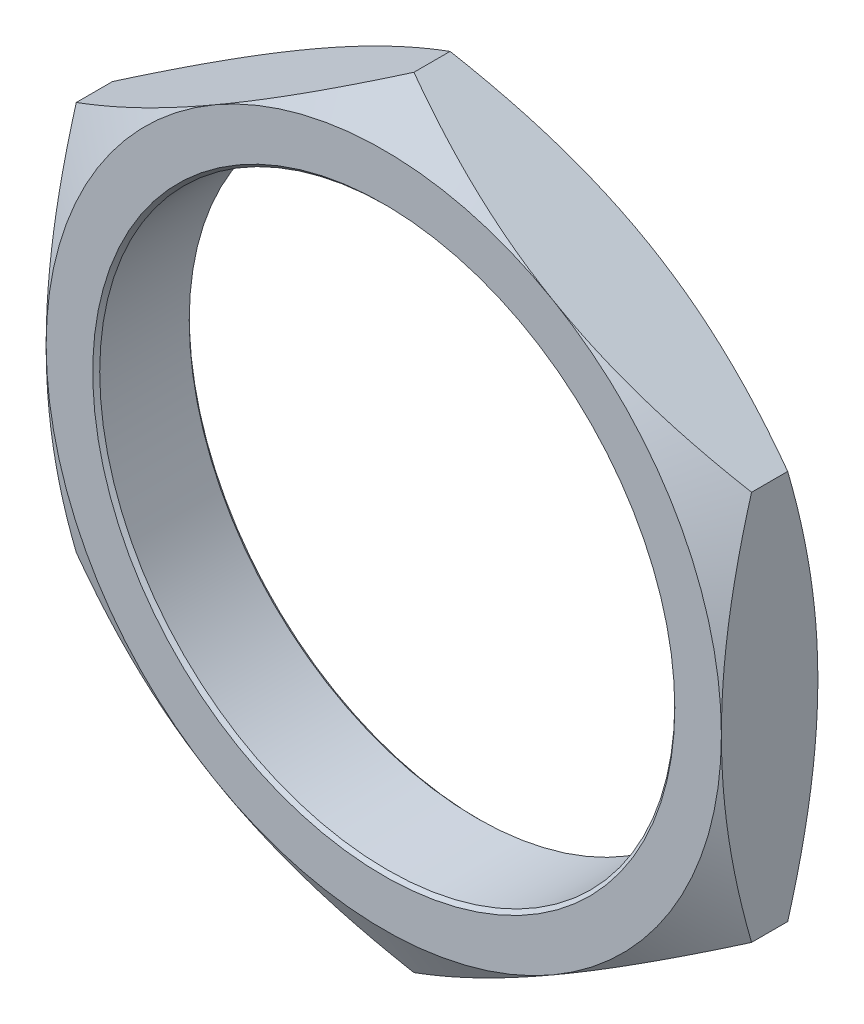
ISO-10303-21;
HEADER;
FILE_DESCRIPTION(('STEP AP214'),'2;1');
FILE_NAME('part.step','',(''),(''),'','','');
FILE_SCHEMA(('AUTOMOTIVE_DESIGN { 1 0 10303 214 1 1 1 1 }'));
ENDSEC;
DATA;
#1=APPLICATION_CONTEXT('core data for automotive mechanical design processes');
#2=APPLICATION_PROTOCOL_DEFINITION('international standard','automotive_design',2000,#1);
#3=PRODUCT_CONTEXT('',#1,'mechanical');
#4=PRODUCT('Part','Part','',(#3));
#5=PRODUCT_RELATED_PRODUCT_CATEGORY('part','',(#4));
#6=PRODUCT_DEFINITION_FORMATION('','',#4);
#7=PRODUCT_DEFINITION_CONTEXT('part definition',#1,'design');
#8=PRODUCT_DEFINITION('design','',#6,#7);
#9=PRODUCT_DEFINITION_SHAPE('','',#8);
#10=(LENGTH_UNIT() NAMED_UNIT(*) SI_UNIT(.MILLI.,.METRE.));
#11=(NAMED_UNIT(*) PLANE_ANGLE_UNIT() SI_UNIT($,.RADIAN.));
#12=(NAMED_UNIT(*) SI_UNIT($,.STERADIAN.) SOLID_ANGLE_UNIT());
#13=UNCERTAINTY_MEASURE_WITH_UNIT(LENGTH_MEASURE(1.E-05),#10,'distance_accuracy_value','');
#14=(GEOMETRIC_REPRESENTATION_CONTEXT(3) GLOBAL_UNCERTAINTY_ASSIGNED_CONTEXT((#13)) GLOBAL_UNIT_ASSIGNED_CONTEXT((#10,
#11,#12)) REPRESENTATION_CONTEXT('',''));
#15=CARTESIAN_POINT('',(0.,0.,0.));
#16=DIRECTION('',(0.,0.,1.));
#17=DIRECTION('',(1.,0.,0.));
#18=AXIS2_PLACEMENT_3D('',#15,#16,#17);
#19=CARTESIAN_POINT('',(0.,0.,3.175));
#20=DIRECTION('',(0.,0.,-1.));
#21=DIRECTION('',(0.,-1.,0.));
#22=AXIS2_PLACEMENT_3D('',#19,#20,#21);
#23=CONICAL_SURFACE('',#22,9.57860794404232,0.785398163397448);
#24=CARTESIAN_POINT('',(0.,0.,3.28956794404232));
#25=DIRECTION('',(0.,0.,1.));
#26=DIRECTION('',(1.,0.,0.));
#27=AXIS2_PLACEMENT_3D('',#24,#25,#26);
#28=CIRCLE('',#27,9.46404);
#29=CARTESIAN_POINT('',(9.46404,0.,3.28956794404232));
#30=VERTEX_POINT('',#29);
#31=EDGE_CURVE('E11',#30,#30,#28,.T.);
#32=ORIENTED_EDGE('',*,*,#31,.T.);
#33=EDGE_LOOP('',(#32));
#34=FACE_BOUND('',#33,.T.);
#35=CARTESIAN_POINT('',(0.,0.,3.175));
#36=DIRECTION('',(0.,0.,1.));
#37=DIRECTION('',(1.,0.,0.));
#38=AXIS2_PLACEMENT_3D('',#35,#36,#37);
#39=CIRCLE('',#38,9.57860794404232);
#40=CARTESIAN_POINT('',(9.57860794404232,0.,3.175));
#41=VERTEX_POINT('',#40);
#42=EDGE_CURVE('E337',#41,#41,#39,.T.);
#43=ORIENTED_EDGE('',*,*,#42,.F.);
#44=EDGE_LOOP('',(#43));
#45=FACE_BOUND('',#44,.T.);
#46=ADVANCED_FACE('F16',(#34,#45),#23,.F.);
#47=CARTESIAN_POINT('',(0.,0.,6.23543205595769));
#48=DIRECTION('',(0.,0.,1.));
#49=DIRECTION('',(1.,0.,0.));
#50=AXIS2_PLACEMENT_3D('',#47,#48,#49);
#51=CONICAL_SURFACE('',#50,9.46404,0.785398163397441);
#52=CARTESIAN_POINT('',(0.,0.,6.23543205595769));
#53=DIRECTION('',(0.,0.,1.));
#54=DIRECTION('',(1.,0.,0.));
#55=AXIS2_PLACEMENT_3D('',#52,#53,#54);
#56=CIRCLE('',#55,9.46404);
#57=CARTESIAN_POINT('',(9.46404,0.,6.23543205595769));
#58=VERTEX_POINT('',#57);
#59=EDGE_CURVE('E347',#58,#58,#56,.T.);
#60=ORIENTED_EDGE('',*,*,#59,.F.);
#61=EDGE_LOOP('',(#60));
#62=FACE_BOUND('',#61,.T.);
#63=CARTESIAN_POINT('',(0.,0.,6.35));
#64=DIRECTION('',(0.,0.,1.));
#65=DIRECTION('',(1.,0.,0.));
#66=AXIS2_PLACEMENT_3D('',#63,#64,#65);
#67=CIRCLE('',#66,9.57860794404232);
#68=CARTESIAN_POINT('',(9.57860794404232,0.,6.35));
#69=VERTEX_POINT('',#68);
#70=EDGE_CURVE('E28',#69,#69,#67,.T.);
#71=ORIENTED_EDGE('',*,*,#70,.T.);
#72=EDGE_LOOP('',(#71));
#73=FACE_BOUND('',#72,.T.);
#74=ADVANCED_FACE('F356',(#62,#73),#51,.F.);
#75=CARTESIAN_POINT('',(0.,0.,6.35));
#76=DIRECTION('',(0.,0.,-1.));
#77=DIRECTION('',(0.,-1.,0.));
#78=AXIS2_PLACEMENT_3D('',#75,#76,#77);
#79=CYLINDRICAL_SURFACE('',#78,9.46404);
#80=ORIENTED_EDGE('',*,*,#59,.T.);
#81=EDGE_LOOP('',(#80));
#82=FACE_BOUND('',#81,.T.);
#83=ORIENTED_EDGE('',*,*,#31,.F.);
#84=EDGE_LOOP('',(#83));
#85=FACE_BOUND('',#84,.T.);
#86=ADVANCED_FACE('F363',(#82,#85),#79,.F.);
#87=CARTESIAN_POINT('',(0.,12.8316097327394,3.175));
#88=DIRECTION('',(0.,0.,1.));
#89=DIRECTION('',(1.,0.,0.));
#90=AXIS2_PLACEMENT_3D('',#87,#88,#89);
#91=PLANE('',#90);
#92=CARTESIAN_POINT('',(0.,0.,3.175));
#93=DIRECTION('',(0.,0.,1.));
#94=DIRECTION('',(1.,0.,0.));
#95=AXIS2_PLACEMENT_3D('',#92,#93,#94);
#96=CIRCLE('',#95,11.1125);
#97=CARTESIAN_POINT('',(11.1125,0.,3.175));
#98=VERTEX_POINT('',#97);
#99=CARTESIAN_POINT('',(5.55625,9.62370729955457,3.175));
#100=VERTEX_POINT('',#99);
#101=EDGE_CURVE('E37',#98,#100,#96,.T.);
#102=ORIENTED_EDGE('',*,*,#101,.F.);
#103=CARTESIAN_POINT('',(0.,0.,3.175));
#104=DIRECTION('',(0.,0.,1.));
#105=DIRECTION('',(1.,0.,0.));
#106=AXIS2_PLACEMENT_3D('',#103,#104,#105);
#107=CIRCLE('',#106,11.1125);
#108=CARTESIAN_POINT('',(5.55625,-9.62370729955457,3.175));
#109=VERTEX_POINT('',#108);
#110=EDGE_CURVE('E185',#109,#98,#107,.T.);
#111=ORIENTED_EDGE('',*,*,#110,.F.);
#112=CARTESIAN_POINT('',(0.,0.,3.175));
#113=DIRECTION('',(0.,0.,1.));
#114=DIRECTION('',(1.,0.,0.));
#115=AXIS2_PLACEMENT_3D('',#112,#113,#114);
#116=CIRCLE('',#115,11.1125);
#117=CARTESIAN_POINT('',(-5.55625,-9.62370729955457,3.175));
#118=VERTEX_POINT('',#117);
#119=EDGE_CURVE('E164',#118,#109,#116,.T.);
#120=ORIENTED_EDGE('',*,*,#119,.F.);
#121=CARTESIAN_POINT('',(0.,0.,3.175));
#122=DIRECTION('',(0.,0.,1.));
#123=DIRECTION('',(1.,0.,0.));
#124=AXIS2_PLACEMENT_3D('',#121,#122,#123);
#125=CIRCLE('',#124,11.1125);
#126=CARTESIAN_POINT('',(-11.1125,0.,3.175));
#127=VERTEX_POINT('',#126);
#128=EDGE_CURVE('E194',#127,#118,#125,.T.);
#129=ORIENTED_EDGE('',*,*,#128,.F.);
#130=CARTESIAN_POINT('',(0.,0.,3.175));
#131=DIRECTION('',(0.,0.,1.));
#132=DIRECTION('',(1.,0.,0.));
#133=AXIS2_PLACEMENT_3D('',#130,#131,#132);
#134=CIRCLE('',#133,11.1125);
#135=CARTESIAN_POINT('',(-5.55625,9.62370729955457,3.175));
#136=VERTEX_POINT('',#135);
#137=EDGE_CURVE('E262',#136,#127,#134,.T.);
#138=ORIENTED_EDGE('',*,*,#137,.F.);
#139=CARTESIAN_POINT('',(0.,0.,3.175));
#140=DIRECTION('',(0.,0.,1.));
#141=DIRECTION('',(1.,0.,0.));
#142=AXIS2_PLACEMENT_3D('',#139,#140,#141);
#143=CIRCLE('',#142,11.1125);
#144=EDGE_CURVE('E293',#100,#136,#143,.T.);
#145=ORIENTED_EDGE('',*,*,#144,.F.);
#146=EDGE_LOOP('',(#102,#111,#120,#129,#138,#145));
#147=FACE_BOUND('',#146,.T.);
#148=ORIENTED_EDGE('',*,*,#42,.T.);
#149=EDGE_LOOP('',(#148));
#150=FACE_BOUND('',#149,.T.);
#151=ADVANCED_FACE('F353',(#147,#150),#91,.F.);
#152=CARTESIAN_POINT('',(0.,12.8316097327394,6.35));
#153=DIRECTION('',(0.,0.,1.));
#154=DIRECTION('',(1.,0.,0.));
#155=AXIS2_PLACEMENT_3D('',#152,#153,#154);
#156=PLANE('',#155);
#157=CARTESIAN_POINT('',(0.,0.,6.35));
#158=DIRECTION('',(0.,0.,1.));
#159=DIRECTION('',(1.,0.,0.));
#160=AXIS2_PLACEMENT_3D('',#157,#158,#159);
#161=CIRCLE('',#160,11.1125);
#162=CARTESIAN_POINT('',(5.55625,-9.62370729955457,6.35));
#163=VERTEX_POINT('',#162);
#164=CARTESIAN_POINT('',(11.1125,0.,6.35));
#165=VERTEX_POINT('',#164);
#166=EDGE_CURVE('E117',#163,#165,#161,.T.);
#167=ORIENTED_EDGE('',*,*,#166,.T.);
#168=CARTESIAN_POINT('',(0.,0.,6.35));
#169=DIRECTION('',(0.,0.,1.));
#170=DIRECTION('',(1.,0.,0.));
#171=AXIS2_PLACEMENT_3D('',#168,#169,#170);
#172=CIRCLE('',#171,11.1125);
#173=CARTESIAN_POINT('',(5.55625,9.62370729955458,6.35));
#174=VERTEX_POINT('',#173);
#175=EDGE_CURVE('E333',#165,#174,#172,.T.);
#176=ORIENTED_EDGE('',*,*,#175,.T.);
#177=CARTESIAN_POINT('',(0.,0.,6.35));
#178=DIRECTION('',(0.,0.,1.));
#179=DIRECTION('',(1.,0.,0.));
#180=AXIS2_PLACEMENT_3D('',#177,#178,#179);
#181=CIRCLE('',#180,11.1125);
#182=CARTESIAN_POINT('',(-5.55625,9.62370729955458,6.35));
#183=VERTEX_POINT('',#182);
#184=EDGE_CURVE('E330',#174,#183,#181,.T.);
#185=ORIENTED_EDGE('',*,*,#184,.T.);
#186=CARTESIAN_POINT('',(0.,0.,6.35));
#187=DIRECTION('',(0.,0.,1.));
#188=DIRECTION('',(1.,0.,0.));
#189=AXIS2_PLACEMENT_3D('',#186,#187,#188);
#190=CIRCLE('',#189,11.1125);
#191=CARTESIAN_POINT('',(-11.1125,0.,6.35));
#192=VERTEX_POINT('',#191);
#193=EDGE_CURVE('E327',#183,#192,#190,.T.);
#194=ORIENTED_EDGE('',*,*,#193,.T.);
#195=CARTESIAN_POINT('',(0.,0.,6.35));
#196=DIRECTION('',(0.,0.,1.));
#197=DIRECTION('',(1.,0.,0.));
#198=AXIS2_PLACEMENT_3D('',#195,#196,#197);
#199=CIRCLE('',#198,11.1125);
#200=CARTESIAN_POINT('',(-5.55625,-9.62370729955457,6.35));
#201=VERTEX_POINT('',#200);
#202=EDGE_CURVE('E324',#192,#201,#199,.T.);
#203=ORIENTED_EDGE('',*,*,#202,.T.);
#204=CARTESIAN_POINT('',(0.,0.,6.35));
#205=DIRECTION('',(0.,0.,1.));
#206=DIRECTION('',(1.,0.,0.));
#207=AXIS2_PLACEMENT_3D('',#204,#205,#206);
#208=CIRCLE('',#207,11.1125);
#209=EDGE_CURVE('E300',#201,#163,#208,.T.);
#210=ORIENTED_EDGE('',*,*,#209,.T.);
#211=EDGE_LOOP('',(#167,#176,#185,#194,#203,#210));
#212=FACE_BOUND('',#211,.T.);
#213=ORIENTED_EDGE('',*,*,#70,.F.);
#214=EDGE_LOOP('',(#213));
#215=FACE_BOUND('',#214,.T.);
#216=ADVANCED_FACE('F432',(#212,#215),#156,.T.);
#217=CARTESIAN_POINT('',(11.1125,6.41580486636973,6.35));
#218=DIRECTION('',(-0.5,-0.866025403784439,0.));
#219=DIRECTION('',(0.866025403784439,-0.5,0.));
#220=AXIS2_PLACEMENT_3D('',#217,#218,#219);
#221=PLANE('',#220);
#222=CARTESIAN_POINT('',(-7.0832056914815,16.9211004454418,7.35000000000001));
#223=CARTESIAN_POINT('',(5.55625,9.62370729955458,0.6458262823206));
#224=CARTESIAN_POINT('',(18.1957056914815,2.32631415366739,7.35));
#225=(BOUNDED_CURVE() B_SPLINE_CURVE(2,(#222,#223,#224),.UNSPECIFIED.,.F.,
.F.) B_SPLINE_CURVE_WITH_KNOTS((3,3),(0.,3.03603960384291),
.UNSPECIFIED.) CURVE() GEOMETRIC_REPRESENTATION_ITEM() RATIONAL_B_SPLINE_CURVE((1.,
1.65073674885041,1.)) REPRESENTATION_ITEM(''));
#226=CARTESIAN_POINT('',(0.,12.8316097327394,4.16752846696361));
#227=VERTEX_POINT('',#226);
#228=EDGE_CURVE('E263',#227,#100,#225,.T.);
#229=ORIENTED_EDGE('',*,*,#228,.F.);
#230=DIRECTION('',(0.,0.,-1.));
#231=VECTOR('',#230,1.);
#232=CARTESIAN_POINT('',(0.,12.8316097327394,6.35));
#233=LINE('',#232,#231);
#234=CARTESIAN_POINT('',(0.,12.8316097327394,5.3574715330364));
#235=VERTEX_POINT('',#234);
#236=EDGE_CURVE('E282',#235,#227,#233,.T.);
#237=ORIENTED_EDGE('',*,*,#236,.F.);
#238=CARTESIAN_POINT('',(18.1957056914815,2.32631415366739,2.175));
#239=CARTESIAN_POINT('',(5.55625,9.62370729955458,8.8791737176794));
#240=CARTESIAN_POINT('',(-7.0832056914815,16.9211004454418,2.17499999999999));
#241=(BOUNDED_CURVE() B_SPLINE_CURVE(2,(#238,#239,#240),.UNSPECIFIED.,.F.,
.F.) B_SPLINE_CURVE_WITH_KNOTS((3,3),(0.,3.03603960384291),
.UNSPECIFIED.) CURVE() GEOMETRIC_REPRESENTATION_ITEM() RATIONAL_B_SPLINE_CURVE((1.,
1.65073674885041,1.)) REPRESENTATION_ITEM(''));
#242=EDGE_CURVE('E237',#174,#235,#241,.T.);
#243=ORIENTED_EDGE('',*,*,#242,.F.);
#244=CARTESIAN_POINT('',(18.1957056914815,2.32631415366739,2.175));
#245=CARTESIAN_POINT('',(5.55625,9.62370729955458,8.8791737176794));
#246=CARTESIAN_POINT('',(-7.0832056914815,16.9211004454418,2.17499999999999));
#247=(BOUNDED_CURVE() B_SPLINE_CURVE(2,(#244,#245,#246),.UNSPECIFIED.,.F.,
.F.) B_SPLINE_CURVE_WITH_KNOTS((3,3),(0.,3.03603960384291),
.UNSPECIFIED.) CURVE() GEOMETRIC_REPRESENTATION_ITEM() RATIONAL_B_SPLINE_CURVE((1.,
1.65073674885041,1.)) REPRESENTATION_ITEM(''));
#248=CARTESIAN_POINT('',(11.1125,6.41580486636973,5.3574715330364));
#249=VERTEX_POINT('',#248);
#250=EDGE_CURVE('E129',#249,#174,#247,.T.);
#251=ORIENTED_EDGE('',*,*,#250,.F.);
#252=DIRECTION('',(0.,0.,-1.));
#253=VECTOR('',#252,1.);
#254=CARTESIAN_POINT('',(11.1125,6.41580486636973,6.35));
#255=LINE('',#254,#253);
#256=CARTESIAN_POINT('',(11.1125,6.41580486636973,4.16752846696361));
#257=VERTEX_POINT('',#256);
#258=EDGE_CURVE('E294',#249,#257,#255,.T.);
#259=ORIENTED_EDGE('',*,*,#258,.T.);
#260=CARTESIAN_POINT('',(-7.0832056914815,16.9211004454418,7.35000000000001));
#261=CARTESIAN_POINT('',(5.55625,9.62370729955458,0.6458262823206));
#262=CARTESIAN_POINT('',(18.1957056914815,2.32631415366739,7.35));
#263=(BOUNDED_CURVE() B_SPLINE_CURVE(2,(#260,#261,#262),.UNSPECIFIED.,.F.,
.F.) B_SPLINE_CURVE_WITH_KNOTS((3,3),(0.,3.03603960384291),
.UNSPECIFIED.) CURVE() GEOMETRIC_REPRESENTATION_ITEM() RATIONAL_B_SPLINE_CURVE((1.,
1.65073674885041,1.)) REPRESENTATION_ITEM(''));
#264=EDGE_CURVE('E155',#100,#257,#263,.T.);
#265=ORIENTED_EDGE('',*,*,#264,.F.);
#266=EDGE_LOOP('',(#229,#237,#243,#251,#259,#265));
#267=FACE_BOUND('',#266,.T.);
#268=ADVANCED_FACE('F421',(#267),#221,.F.);
#269=CARTESIAN_POINT('',(0.,12.8316097327394,6.35));
#270=DIRECTION('',(0.5,-0.866025403784439,0.));
#271=DIRECTION('',(0.866025403784439,0.5,0.));
#272=AXIS2_PLACEMENT_3D('',#269,#270,#271);
#273=PLANE('',#272);
#274=CARTESIAN_POINT('',(-18.1957056914815,2.32631415366738,7.35000000000001));
#275=CARTESIAN_POINT('',(-5.55625,9.62370729955457,0.645826282320595));
#276=CARTESIAN_POINT('',(7.0832056914815,16.9211004454418,7.35000000000001));
#277=(BOUNDED_CURVE() B_SPLINE_CURVE(2,(#274,#275,#276),.UNSPECIFIED.,.F.,
.F.) B_SPLINE_CURVE_WITH_KNOTS((3,3),(0.,3.03603960384291),
.UNSPECIFIED.) CURVE() GEOMETRIC_REPRESENTATION_ITEM() RATIONAL_B_SPLINE_CURVE((1.,
1.65073674885041,1.)) REPRESENTATION_ITEM(''));
#278=CARTESIAN_POINT('',(-11.1125,6.41580486636972,4.16752846696361));
#279=VERTEX_POINT('',#278);
#280=EDGE_CURVE('E228',#279,#136,#277,.T.);
#281=ORIENTED_EDGE('',*,*,#280,.F.);
#282=DIRECTION('',(0.,0.,-1.));
#283=VECTOR('',#282,1.);
#284=CARTESIAN_POINT('',(-11.1125,6.41580486636972,6.35));
#285=LINE('',#284,#283);
#286=CARTESIAN_POINT('',(-11.1125,6.41580486636972,5.3574715330364));
#287=VERTEX_POINT('',#286);
#288=EDGE_CURVE('E249',#287,#279,#285,.T.);
#289=ORIENTED_EDGE('',*,*,#288,.F.);
#290=CARTESIAN_POINT('',(7.0832056914815,16.9211004454418,2.175));
#291=CARTESIAN_POINT('',(-5.55625,9.62370729955458,8.8791737176794));
#292=CARTESIAN_POINT('',(-18.1957056914815,2.32631415366739,2.17499999999999));
#293=(BOUNDED_CURVE() B_SPLINE_CURVE(2,(#290,#291,#292),.UNSPECIFIED.,.F.,
.F.) B_SPLINE_CURVE_WITH_KNOTS((3,3),(0.,3.03603960384291),
.UNSPECIFIED.) CURVE() GEOMETRIC_REPRESENTATION_ITEM() RATIONAL_B_SPLINE_CURVE((1.,
1.65073674885041,1.)) REPRESENTATION_ITEM(''));
#294=EDGE_CURVE('E203',#183,#287,#293,.T.);
#295=ORIENTED_EDGE('',*,*,#294,.F.);
#296=CARTESIAN_POINT('',(7.0832056914815,16.9211004454418,2.175));
#297=CARTESIAN_POINT('',(-5.55625,9.62370729955458,8.8791737176794));
#298=CARTESIAN_POINT('',(-18.1957056914815,2.32631415366739,2.17499999999999));
#299=(BOUNDED_CURVE() B_SPLINE_CURVE(2,(#296,#297,#298),.UNSPECIFIED.,.F.,
.F.) B_SPLINE_CURVE_WITH_KNOTS((3,3),(0.,3.03603960384291),
.UNSPECIFIED.) CURVE() GEOMETRIC_REPRESENTATION_ITEM() RATIONAL_B_SPLINE_CURVE((1.,
1.65073674885041,1.)) REPRESENTATION_ITEM(''));
#300=EDGE_CURVE('E184',#235,#183,#299,.T.);
#301=ORIENTED_EDGE('',*,*,#300,.F.);
#302=ORIENTED_EDGE('',*,*,#236,.T.);
#303=CARTESIAN_POINT('',(-18.1957056914815,2.32631415366738,7.35000000000001));
#304=CARTESIAN_POINT('',(-5.55625,9.62370729955457,0.645826282320595));
#305=CARTESIAN_POINT('',(7.0832056914815,16.9211004454418,7.35000000000001));
#306=(BOUNDED_CURVE() B_SPLINE_CURVE(2,(#303,#304,#305),.UNSPECIFIED.,.F.,
.F.) B_SPLINE_CURVE_WITH_KNOTS((3,3),(0.,3.03603960384291),
.UNSPECIFIED.) CURVE() GEOMETRIC_REPRESENTATION_ITEM() RATIONAL_B_SPLINE_CURVE((1.,
1.65073674885041,1.)) REPRESENTATION_ITEM(''));
#307=EDGE_CURVE('E254',#136,#227,#306,.T.);
#308=ORIENTED_EDGE('',*,*,#307,.F.);
#309=EDGE_LOOP('',(#281,#289,#295,#301,#302,#308));
#310=FACE_BOUND('',#309,.T.);
#311=ADVANCED_FACE('F416',(#310),#273,.F.);
#312=CARTESIAN_POINT('',(-11.1125,6.41580486636972,6.35));
#313=DIRECTION('',(1.,0.,0.));
#314=DIRECTION('',(0.,1.,0.));
#315=AXIS2_PLACEMENT_3D('',#312,#313,#314);
#316=PLANE('',#315);
#317=CARTESIAN_POINT('',(-11.1125,-14.5947862917744,7.35));
#318=CARTESIAN_POINT('',(-11.1125,0.,0.645826282320599));
#319=CARTESIAN_POINT('',(-11.1125,14.5947862917744,7.35));
#320=(BOUNDED_CURVE() B_SPLINE_CURVE(2,(#317,#318,#319),.UNSPECIFIED.,.F.,
.F.) B_SPLINE_CURVE_WITH_KNOTS((3,3),(0.,3.03603960384291),
.UNSPECIFIED.) CURVE() GEOMETRIC_REPRESENTATION_ITEM() RATIONAL_B_SPLINE_CURVE((1.,
1.65073674885041,1.)) REPRESENTATION_ITEM(''));
#321=CARTESIAN_POINT('',(-11.1125,-6.41580486636971,4.16752846696361));
#322=VERTEX_POINT('',#321);
#323=EDGE_CURVE('E165',#322,#127,#320,.T.);
#324=ORIENTED_EDGE('',*,*,#323,.F.);
#325=DIRECTION('',(0.,0.,-1.));
#326=VECTOR('',#325,1.);
#327=CARTESIAN_POINT('',(-11.1125,-6.41580486636972,6.35));
#328=LINE('',#327,#326);
#329=CARTESIAN_POINT('',(-11.1125,-6.41580486636971,5.3574715330364));
#330=VERTEX_POINT('',#329);
#331=EDGE_CURVE('E215',#330,#322,#328,.T.);
#332=ORIENTED_EDGE('',*,*,#331,.F.);
#333=CARTESIAN_POINT('',(-11.1125,14.5947862917744,2.175));
#334=CARTESIAN_POINT('',(-11.1125,0.,8.8791737176794));
#335=CARTESIAN_POINT('',(-11.1125,-14.5947862917744,2.175));
#336=(BOUNDED_CURVE() B_SPLINE_CURVE(2,(#333,#334,#335),.UNSPECIFIED.,.F.,
.F.) B_SPLINE_CURVE_WITH_KNOTS((3,3),(0.,3.03603960384291),
.UNSPECIFIED.) CURVE() GEOMETRIC_REPRESENTATION_ITEM() RATIONAL_B_SPLINE_CURVE((1.,
1.65073674885041,1.)) REPRESENTATION_ITEM(''));
#337=EDGE_CURVE('E171',#192,#330,#336,.T.);
#338=ORIENTED_EDGE('',*,*,#337,.F.);
#339=CARTESIAN_POINT('',(-11.1125,14.5947862917744,2.175));
#340=CARTESIAN_POINT('',(-11.1125,0.,8.8791737176794));
#341=CARTESIAN_POINT('',(-11.1125,-14.5947862917744,2.175));
#342=(BOUNDED_CURVE() B_SPLINE_CURVE(2,(#339,#340,#341),.UNSPECIFIED.,.F.,
.F.) B_SPLINE_CURVE_WITH_KNOTS((3,3),(0.,3.03603960384291),
.UNSPECIFIED.) CURVE() GEOMETRIC_REPRESENTATION_ITEM() RATIONAL_B_SPLINE_CURVE((1.,
1.65073674885041,1.)) REPRESENTATION_ITEM(''));
#343=EDGE_CURVE('E229',#287,#192,#342,.T.);
#344=ORIENTED_EDGE('',*,*,#343,.F.);
#345=ORIENTED_EDGE('',*,*,#288,.T.);
#346=CARTESIAN_POINT('',(-11.1125,-14.5947862917744,7.35));
#347=CARTESIAN_POINT('',(-11.1125,0.,0.645826282320599));
#348=CARTESIAN_POINT('',(-11.1125,14.5947862917744,7.35));
#349=(BOUNDED_CURVE() B_SPLINE_CURVE(2,(#346,#347,#348),.UNSPECIFIED.,.F.,
.F.) B_SPLINE_CURVE_WITH_KNOTS((3,3),(0.,3.03603960384291),
.UNSPECIFIED.) CURVE() GEOMETRIC_REPRESENTATION_ITEM() RATIONAL_B_SPLINE_CURVE((1.,
1.65073674885041,1.)) REPRESENTATION_ITEM(''));
#350=EDGE_CURVE('E195',#127,#279,#349,.T.);
#351=ORIENTED_EDGE('',*,*,#350,.F.);
#352=EDGE_LOOP('',(#324,#332,#338,#344,#345,#351));
#353=FACE_BOUND('',#352,.T.);
#354=ADVANCED_FACE('F427',(#353),#316,.F.);
#355=CARTESIAN_POINT('',(-11.1125,-6.41580486636972,6.35));
#356=DIRECTION('',(0.5,0.866025403784439,0.));
#357=DIRECTION('',(-0.866025403784439,0.5,0.));
#358=AXIS2_PLACEMENT_3D('',#355,#356,#357);
#359=PLANE('',#358);
#360=CARTESIAN_POINT('',(7.0832056914815,-16.9211004454418,7.35000000000001));
#361=CARTESIAN_POINT('',(-5.55625,-9.62370729955457,0.645826282320595));
#362=CARTESIAN_POINT('',(-18.1957056914815,-2.32631415366738,7.35000000000001));
#363=(BOUNDED_CURVE() B_SPLINE_CURVE(2,(#360,#361,#362),.UNSPECIFIED.,.F.,
.F.) B_SPLINE_CURVE_WITH_KNOTS((3,3),(0.,3.03603960384291),
.UNSPECIFIED.) CURVE() GEOMETRIC_REPRESENTATION_ITEM() RATIONAL_B_SPLINE_CURVE((1.,
1.65073674885041,1.)) REPRESENTATION_ITEM(''));
#364=CARTESIAN_POINT('',(0.,-12.8316097327394,4.16752846696361));
#365=VERTEX_POINT('',#364);
#366=EDGE_CURVE('E216',#365,#118,#363,.T.);
#367=ORIENTED_EDGE('',*,*,#366,.F.);
#368=DIRECTION('',(0.,0.,-1.));
#369=VECTOR('',#368,1.);
#370=CARTESIAN_POINT('',(0.,-12.8316097327394,6.35));
#371=LINE('',#370,#369);
#372=CARTESIAN_POINT('',(0.,-12.8316097327394,5.3574715330364));
#373=VERTEX_POINT('',#372);
#374=EDGE_CURVE('E128',#373,#365,#371,.T.);
#375=ORIENTED_EDGE('',*,*,#374,.F.);
#376=CARTESIAN_POINT('',(-18.1957056914815,-2.32631415366738,2.175));
#377=CARTESIAN_POINT('',(-5.55625,-9.62370729955457,8.87917371767941));
#378=CARTESIAN_POINT('',(7.0832056914815,-16.9211004454418,2.17499999999999));
#379=(BOUNDED_CURVE() B_SPLINE_CURVE(2,(#376,#377,#378),.UNSPECIFIED.,.F.,
.F.) B_SPLINE_CURVE_WITH_KNOTS((3,3),(0.,3.03603960384291),
.UNSPECIFIED.) CURVE() GEOMETRIC_REPRESENTATION_ITEM() RATIONAL_B_SPLINE_CURVE((1.,
1.65073674885041,1.)) REPRESENTATION_ITEM(''));
#380=EDGE_CURVE('E136',#201,#373,#379,.T.);
#381=ORIENTED_EDGE('',*,*,#380,.F.);
#382=CARTESIAN_POINT('',(-18.1957056914815,-2.32631415366738,2.175));
#383=CARTESIAN_POINT('',(-5.55625,-9.62370729955457,8.87917371767941));
#384=CARTESIAN_POINT('',(7.0832056914815,-16.9211004454418,2.17499999999999));
#385=(BOUNDED_CURVE() B_SPLINE_CURVE(2,(#382,#383,#384),.UNSPECIFIED.,.F.,
.F.) B_SPLINE_CURVE_WITH_KNOTS((3,3),(0.,3.03603960384291),
.UNSPECIFIED.) CURVE() GEOMETRIC_REPRESENTATION_ITEM() RATIONAL_B_SPLINE_CURVE((1.,
1.65073674885041,1.)) REPRESENTATION_ITEM(''));
#386=EDGE_CURVE('E196',#330,#201,#385,.T.);
#387=ORIENTED_EDGE('',*,*,#386,.F.);
#388=ORIENTED_EDGE('',*,*,#331,.T.);
#389=CARTESIAN_POINT('',(7.0832056914815,-16.9211004454418,7.35000000000001));
#390=CARTESIAN_POINT('',(-5.55625,-9.62370729955457,0.645826282320595));
#391=CARTESIAN_POINT('',(-18.1957056914815,-2.32631415366738,7.35000000000001));
#392=(BOUNDED_CURVE() B_SPLINE_CURVE(2,(#389,#390,#391),.UNSPECIFIED.,.F.,
.F.) B_SPLINE_CURVE_WITH_KNOTS((3,3),(0.,3.03603960384291),
.UNSPECIFIED.) CURVE() GEOMETRIC_REPRESENTATION_ITEM() RATIONAL_B_SPLINE_CURVE((1.,
1.65073674885041,1.)) REPRESENTATION_ITEM(''));
#393=EDGE_CURVE('E186',#118,#322,#392,.T.);
#394=ORIENTED_EDGE('',*,*,#393,.F.);
#395=EDGE_LOOP('',(#367,#375,#381,#387,#388,#394));
#396=FACE_BOUND('',#395,.T.);
#397=ADVANCED_FACE('F437',(#396),#359,.F.);
#398=CARTESIAN_POINT('',(0.,-12.8316097327394,6.35));
#399=DIRECTION('',(-0.5,0.866025403784439,0.));
#400=DIRECTION('',(-0.866025403784439,-0.5,0.));
#401=AXIS2_PLACEMENT_3D('',#398,#399,#400);
#402=PLANE('',#401);
#403=CARTESIAN_POINT('',(18.1957056914815,-2.32631415366739,7.35000000000001));
#404=CARTESIAN_POINT('',(5.55625,-9.62370729955457,0.645826282320593));
#405=CARTESIAN_POINT('',(-7.08320569148151,-16.9211004454418,7.35000000000001));
#406=(BOUNDED_CURVE() B_SPLINE_CURVE(2,(#403,#404,#405),.UNSPECIFIED.,.F.,
.F.) B_SPLINE_CURVE_WITH_KNOTS((3,3),(0.,3.03603960384291),
.UNSPECIFIED.) CURVE() GEOMETRIC_REPRESENTATION_ITEM() RATIONAL_B_SPLINE_CURVE((1.,
1.65073674885041,1.)) REPRESENTATION_ITEM(''));
#407=CARTESIAN_POINT('',(11.1125,-6.41580486636973,4.16752846696361));
#408=VERTEX_POINT('',#407);
#409=EDGE_CURVE('E106',#408,#109,#406,.T.);
#410=ORIENTED_EDGE('',*,*,#409,.F.);
#411=DIRECTION('',(0.,0.,-1.));
#412=VECTOR('',#411,1.);
#413=CARTESIAN_POINT('',(11.1125,-6.41580486636972,6.35));
#414=LINE('',#413,#412);
#415=CARTESIAN_POINT('',(11.1125,-6.41580486636973,5.3574715330364));
#416=VERTEX_POINT('',#415);
#417=EDGE_CURVE('E123',#416,#408,#414,.T.);
#418=ORIENTED_EDGE('',*,*,#417,.F.);
#419=CARTESIAN_POINT('',(-7.08320569148151,-16.9211004454418,2.17499999999999));
#420=CARTESIAN_POINT('',(5.55625,-9.62370729955457,8.8791737176794));
#421=CARTESIAN_POINT('',(18.1957056914815,-2.32631415366738,2.17499999999999));
#422=(BOUNDED_CURVE() B_SPLINE_CURVE(2,(#419,#420,#421),.UNSPECIFIED.,.F.,
.F.) B_SPLINE_CURVE_WITH_KNOTS((3,3),(0.,3.03603960384291),
.UNSPECIFIED.) CURVE() GEOMETRIC_REPRESENTATION_ITEM() RATIONAL_B_SPLINE_CURVE((1.,
1.65073674885041,1.)) REPRESENTATION_ITEM(''));
#423=EDGE_CURVE('E112',#163,#416,#422,.T.);
#424=ORIENTED_EDGE('',*,*,#423,.F.);
#425=CARTESIAN_POINT('',(-7.08320569148151,-16.9211004454418,2.17499999999999));
#426=CARTESIAN_POINT('',(5.55625,-9.62370729955457,8.8791737176794));
#427=CARTESIAN_POINT('',(18.1957056914815,-2.32631415366738,2.17499999999999));
#428=(BOUNDED_CURVE() B_SPLINE_CURVE(2,(#425,#426,#427),.UNSPECIFIED.,.F.,
.F.) B_SPLINE_CURVE_WITH_KNOTS((3,3),(0.,3.03603960384291),
.UNSPECIFIED.) CURVE() GEOMETRIC_REPRESENTATION_ITEM() RATIONAL_B_SPLINE_CURVE((1.,
1.65073674885041,1.)) REPRESENTATION_ITEM(''));
#429=EDGE_CURVE('E137',#373,#163,#428,.T.);
#430=ORIENTED_EDGE('',*,*,#429,.F.);
#431=ORIENTED_EDGE('',*,*,#374,.T.);
#432=CARTESIAN_POINT('',(18.1957056914815,-2.32631415366739,7.35000000000001));
#433=CARTESIAN_POINT('',(5.55625,-9.62370729955457,0.645826282320593));
#434=CARTESIAN_POINT('',(-7.08320569148151,-16.9211004454418,7.35000000000001));
#435=(BOUNDED_CURVE() B_SPLINE_CURVE(2,(#432,#433,#434),.UNSPECIFIED.,.F.,
.F.) B_SPLINE_CURVE_WITH_KNOTS((3,3),(0.,3.03603960384291),
.UNSPECIFIED.) CURVE() GEOMETRIC_REPRESENTATION_ITEM() RATIONAL_B_SPLINE_CURVE((1.,
1.65073674885041,1.)) REPRESENTATION_ITEM(''));
#436=EDGE_CURVE('E156',#109,#365,#435,.T.);
#437=ORIENTED_EDGE('',*,*,#436,.F.);
#438=EDGE_LOOP('',(#410,#418,#424,#430,#431,#437));
#439=FACE_BOUND('',#438,.T.);
#440=ADVANCED_FACE('F124',(#439),#402,.F.);
#441=CARTESIAN_POINT('',(11.1125,-6.41580486636972,6.35));
#442=DIRECTION('',(-1.,0.,0.));
#443=DIRECTION('',(0.,-1.,0.));
#444=AXIS2_PLACEMENT_3D('',#441,#442,#443);
#445=PLANE('',#444);
#446=CARTESIAN_POINT('',(11.1125,14.5947862917744,7.35000000000001));
#447=CARTESIAN_POINT('',(11.1125,0.,0.645826282320588));
#448=CARTESIAN_POINT('',(11.1125,-14.5947862917744,7.35000000000001));
#449=(BOUNDED_CURVE() B_SPLINE_CURVE(2,(#446,#447,#448),.UNSPECIFIED.,.F.,
.F.) B_SPLINE_CURVE_WITH_KNOTS((3,3),(0.,3.03603960384291),
.UNSPECIFIED.) CURVE() GEOMETRIC_REPRESENTATION_ITEM() RATIONAL_B_SPLINE_CURVE((1.,
1.65073674885041,1.)) REPRESENTATION_ITEM(''));
#450=EDGE_CURVE('E148',#257,#98,#449,.T.);
#451=ORIENTED_EDGE('',*,*,#450,.F.);
#452=ORIENTED_EDGE('',*,*,#258,.F.);
#453=CARTESIAN_POINT('',(11.1125,-14.5947862917744,2.175));
#454=CARTESIAN_POINT('',(11.1125,0.,8.87917371767941));
#455=CARTESIAN_POINT('',(11.1125,14.5947862917744,2.175));
#456=(BOUNDED_CURVE() B_SPLINE_CURVE(2,(#453,#454,#455),.UNSPECIFIED.,.F.,
.F.) B_SPLINE_CURVE_WITH_KNOTS((3,3),(0.,3.03603960384291),
.UNSPECIFIED.) CURVE() GEOMETRIC_REPRESENTATION_ITEM() RATIONAL_B_SPLINE_CURVE((1.,
1.65073674885041,1.)) REPRESENTATION_ITEM(''));
#457=EDGE_CURVE('E121',#165,#249,#456,.T.);
#458=ORIENTED_EDGE('',*,*,#457,.F.);
#459=CARTESIAN_POINT('',(11.1125,-14.5947862917744,2.175));
#460=CARTESIAN_POINT('',(11.1125,0.,8.87917371767941));
#461=CARTESIAN_POINT('',(11.1125,14.5947862917744,2.175));
#462=(BOUNDED_CURVE() B_SPLINE_CURVE(2,(#459,#460,#461),.UNSPECIFIED.,.F.,
.F.) B_SPLINE_CURVE_WITH_KNOTS((3,3),(0.,3.03603960384291),
.UNSPECIFIED.) CURVE() GEOMETRIC_REPRESENTATION_ITEM() RATIONAL_B_SPLINE_CURVE((1.,
1.65073674885041,1.)) REPRESENTATION_ITEM(''));
#463=EDGE_CURVE('E115',#416,#165,#462,.T.);
#464=ORIENTED_EDGE('',*,*,#463,.F.);
#465=ORIENTED_EDGE('',*,*,#417,.T.);
#466=CARTESIAN_POINT('',(11.1125,14.5947862917744,7.35000000000001));
#467=CARTESIAN_POINT('',(11.1125,0.,0.645826282320588));
#468=CARTESIAN_POINT('',(11.1125,-14.5947862917744,7.35000000000001));
#469=(BOUNDED_CURVE() B_SPLINE_CURVE(2,(#466,#467,#468),.UNSPECIFIED.,.F.,
.F.) B_SPLINE_CURVE_WITH_KNOTS((3,3),(0.,3.03603960384291),
.UNSPECIFIED.) CURVE() GEOMETRIC_REPRESENTATION_ITEM() RATIONAL_B_SPLINE_CURVE((1.,
1.65073674885041,1.)) REPRESENTATION_ITEM(''));
#470=EDGE_CURVE('E20',#98,#408,#469,.T.);
#471=ORIENTED_EDGE('',*,*,#470,.F.);
#472=EDGE_LOOP('',(#451,#452,#458,#464,#465,#471));
#473=FACE_BOUND('',#472,.T.);
#474=ADVANCED_FACE('F132',(#473),#445,.F.);
#475=CARTESIAN_POINT('',(0.,0.,6.35));
#476=DIRECTION('',(0.,0.,-1.));
#477=DIRECTION('',(0.,-1.,0.));
#478=AXIS2_PLACEMENT_3D('',#475,#476,#477);
#479=CONICAL_SURFACE('',#478,11.1125,1.0471975511966);
#480=ORIENTED_EDGE('',*,*,#250,.T.);
#481=ORIENTED_EDGE('',*,*,#175,.F.);
#482=ORIENTED_EDGE('',*,*,#457,.T.);
#483=EDGE_LOOP('',(#480,#481,#482));
#484=FACE_BOUND('',#483,.T.);
#485=ADVANCED_FACE('F368',(#484),#479,.T.);
#486=CARTESIAN_POINT('',(0.,0.,6.35));
#487=DIRECTION('',(0.,0.,-1.));
#488=DIRECTION('',(0.,-1.,0.));
#489=AXIS2_PLACEMENT_3D('',#486,#487,#488);
#490=CONICAL_SURFACE('',#489,11.1125,1.0471975511966);
#491=ORIENTED_EDGE('',*,*,#423,.T.);
#492=ORIENTED_EDGE('',*,*,#463,.T.);
#493=ORIENTED_EDGE('',*,*,#166,.F.);
#494=EDGE_LOOP('',(#491,#492,#493));
#495=FACE_BOUND('',#494,.T.);
#496=ADVANCED_FACE('F113',(#495),#490,.T.);
#497=CARTESIAN_POINT('',(0.,0.,6.35));
#498=DIRECTION('',(0.,0.,-1.));
#499=DIRECTION('',(0.,-1.,0.));
#500=AXIS2_PLACEMENT_3D('',#497,#498,#499);
#501=CONICAL_SURFACE('',#500,11.1125,1.0471975511966);
#502=ORIENTED_EDGE('',*,*,#380,.T.);
#503=ORIENTED_EDGE('',*,*,#429,.T.);
#504=ORIENTED_EDGE('',*,*,#209,.F.);
#505=EDGE_LOOP('',(#502,#503,#504));
#506=FACE_BOUND('',#505,.T.);
#507=ADVANCED_FACE('F374',(#506),#501,.T.);
#508=CARTESIAN_POINT('',(0.,0.,6.35));
#509=DIRECTION('',(0.,0.,-1.));
#510=DIRECTION('',(0.,-1.,0.));
#511=AXIS2_PLACEMENT_3D('',#508,#509,#510);
#512=CONICAL_SURFACE('',#511,11.1125,1.0471975511966);
#513=ORIENTED_EDGE('',*,*,#337,.T.);
#514=ORIENTED_EDGE('',*,*,#386,.T.);
#515=ORIENTED_EDGE('',*,*,#202,.F.);
#516=EDGE_LOOP('',(#513,#514,#515));
#517=FACE_BOUND('',#516,.T.);
#518=ADVANCED_FACE('F377',(#517),#512,.T.);
#519=CARTESIAN_POINT('',(0.,0.,6.35));
#520=DIRECTION('',(0.,0.,-1.));
#521=DIRECTION('',(0.,-1.,0.));
#522=AXIS2_PLACEMENT_3D('',#519,#520,#521);
#523=CONICAL_SURFACE('',#522,11.1125,1.0471975511966);
#524=ORIENTED_EDGE('',*,*,#294,.T.);
#525=ORIENTED_EDGE('',*,*,#343,.T.);
#526=ORIENTED_EDGE('',*,*,#193,.F.);
#527=EDGE_LOOP('',(#524,#525,#526));
#528=FACE_BOUND('',#527,.T.);
#529=ADVANCED_FACE('F381',(#528),#523,.T.);
#530=CARTESIAN_POINT('',(0.,0.,6.35));
#531=DIRECTION('',(0.,0.,-1.));
#532=DIRECTION('',(0.,-1.,0.));
#533=AXIS2_PLACEMENT_3D('',#530,#531,#532);
#534=CONICAL_SURFACE('',#533,11.1125,1.0471975511966);
#535=ORIENTED_EDGE('',*,*,#242,.T.);
#536=ORIENTED_EDGE('',*,*,#300,.T.);
#537=ORIENTED_EDGE('',*,*,#184,.F.);
#538=EDGE_LOOP('',(#535,#536,#537));
#539=FACE_BOUND('',#538,.T.);
#540=ADVANCED_FACE('F383',(#539),#534,.T.);
#541=CARTESIAN_POINT('',(0.,0.,4.16752846696361));
#542=DIRECTION('',(0.,0.,1.));
#543=DIRECTION('',(1.,0.,0.));
#544=AXIS2_PLACEMENT_3D('',#541,#542,#543);
#545=CONICAL_SURFACE('',#544,12.8316097327394,1.0471975511966);
#546=ORIENTED_EDGE('',*,*,#409,.T.);
#547=ORIENTED_EDGE('',*,*,#110,.T.);
#548=ORIENTED_EDGE('',*,*,#470,.T.);
#549=EDGE_LOOP('',(#546,#547,#548));
#550=FACE_BOUND('',#549,.T.);
#551=ADVANCED_FACE('F386',(#550),#545,.T.);
#552=CARTESIAN_POINT('',(0.,0.,4.16752846696361));
#553=DIRECTION('',(0.,0.,1.));
#554=DIRECTION('',(1.,0.,0.));
#555=AXIS2_PLACEMENT_3D('',#552,#553,#554);
#556=CONICAL_SURFACE('',#555,12.8316097327394,1.0471975511966);
#557=ORIENTED_EDGE('',*,*,#366,.T.);
#558=ORIENTED_EDGE('',*,*,#119,.T.);
#559=ORIENTED_EDGE('',*,*,#436,.T.);
#560=EDGE_LOOP('',(#557,#558,#559));
#561=FACE_BOUND('',#560,.T.);
#562=ADVANCED_FACE('F393',(#561),#556,.T.);
#563=CARTESIAN_POINT('',(0.,0.,4.16752846696361));
#564=DIRECTION('',(0.,0.,1.));
#565=DIRECTION('',(1.,0.,0.));
#566=AXIS2_PLACEMENT_3D('',#563,#564,#565);
#567=CONICAL_SURFACE('',#566,12.8316097327394,1.0471975511966);
#568=ORIENTED_EDGE('',*,*,#323,.T.);
#569=ORIENTED_EDGE('',*,*,#128,.T.);
#570=ORIENTED_EDGE('',*,*,#393,.T.);
#571=EDGE_LOOP('',(#568,#569,#570));
#572=FACE_BOUND('',#571,.T.);
#573=ADVANCED_FACE('F397',(#572),#567,.T.);
#574=CARTESIAN_POINT('',(0.,0.,4.16752846696361));
#575=DIRECTION('',(0.,0.,1.));
#576=DIRECTION('',(1.,0.,0.));
#577=AXIS2_PLACEMENT_3D('',#574,#575,#576);
#578=CONICAL_SURFACE('',#577,12.8316097327394,1.0471975511966);
#579=ORIENTED_EDGE('',*,*,#350,.T.);
#580=ORIENTED_EDGE('',*,*,#280,.T.);
#581=ORIENTED_EDGE('',*,*,#137,.T.);
#582=EDGE_LOOP('',(#579,#580,#581));
#583=FACE_BOUND('',#582,.T.);
#584=ADVANCED_FACE('F18',(#583),#578,.T.);
#585=CARTESIAN_POINT('',(0.,0.,4.16752846696361));
#586=DIRECTION('',(0.,0.,1.));
#587=DIRECTION('',(1.,0.,0.));
#588=AXIS2_PLACEMENT_3D('',#585,#586,#587);
#589=CONICAL_SURFACE('',#588,12.8316097327394,1.0471975511966);
#590=ORIENTED_EDGE('',*,*,#307,.T.);
#591=ORIENTED_EDGE('',*,*,#228,.T.);
#592=ORIENTED_EDGE('',*,*,#144,.T.);
#593=EDGE_LOOP('',(#590,#591,#592));
#594=FACE_BOUND('',#593,.T.);
#595=ADVANCED_FACE('F404',(#594),#589,.T.);
#596=CARTESIAN_POINT('',(0.,0.,4.16752846696361));
#597=DIRECTION('',(0.,0.,1.));
#598=DIRECTION('',(1.,0.,0.));
#599=AXIS2_PLACEMENT_3D('',#596,#597,#598);
#600=CONICAL_SURFACE('',#599,12.8316097327394,1.0471975511966);
#601=ORIENTED_EDGE('',*,*,#264,.T.);
#602=ORIENTED_EDGE('',*,*,#450,.T.);
#603=ORIENTED_EDGE('',*,*,#101,.T.);
#604=EDGE_LOOP('',(#601,#602,#603));
#605=FACE_BOUND('',#604,.T.);
#606=ADVANCED_FACE('F402',(#605),#600,.T.);
#607=CLOSED_SHELL('',(#46,#74,#86,#151,#216,#268,#311,#354,#397,#440,#474,#485,#496,#507,#518,
#529,#540,#551,#562,#573,#584,#595,#606));
#608=MANIFOLD_SOLID_BREP('B1',#607);
#609=ADVANCED_BREP_SHAPE_REPRESENTATION('',(#18,#608),#14);
#610=SHAPE_DEFINITION_REPRESENTATION(#9,#609);
ENDSEC;
END-ISO-10303-21;
